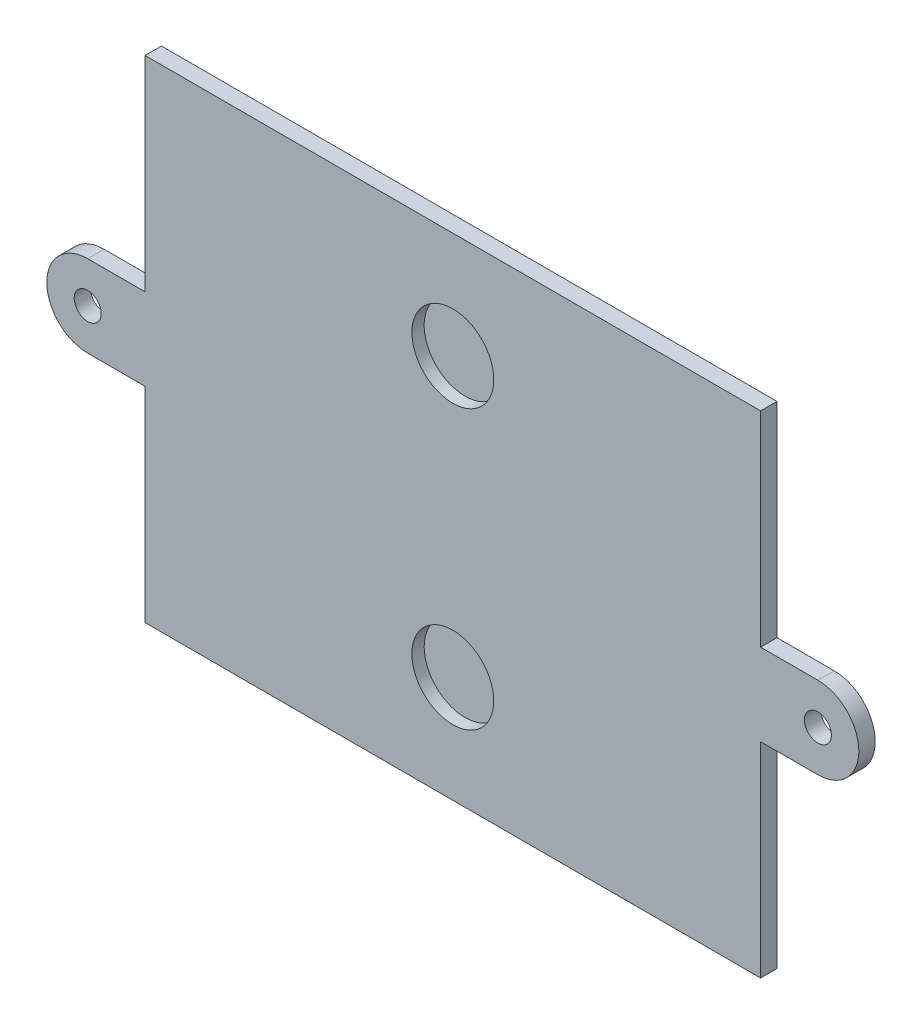
ISO-10303-21;
HEADER;
FILE_DESCRIPTION(('STEP AP214'),'2;1');
FILE_NAME('part.step','',(''),(''),'','','');
FILE_SCHEMA(('AUTOMOTIVE_DESIGN { 1 0 10303 214 1 1 1 1 }'));
ENDSEC;
DATA;
#1=APPLICATION_CONTEXT('core data for automotive mechanical design processes');
#2=APPLICATION_PROTOCOL_DEFINITION('international standard','automotive_design',2000,#1);
#3=PRODUCT_CONTEXT('',#1,'mechanical');
#4=PRODUCT('Part','Part','',(#3));
#5=PRODUCT_RELATED_PRODUCT_CATEGORY('part','',(#4));
#6=PRODUCT_DEFINITION_FORMATION('','',#4);
#7=PRODUCT_DEFINITION_CONTEXT('part definition',#1,'design');
#8=PRODUCT_DEFINITION('design','',#6,#7);
#9=PRODUCT_DEFINITION_SHAPE('','',#8);
#10=(LENGTH_UNIT() NAMED_UNIT(*) SI_UNIT(.MILLI.,.METRE.));
#11=(NAMED_UNIT(*) PLANE_ANGLE_UNIT() SI_UNIT($,.RADIAN.));
#12=(NAMED_UNIT(*) SI_UNIT($,.STERADIAN.) SOLID_ANGLE_UNIT());
#13=UNCERTAINTY_MEASURE_WITH_UNIT(LENGTH_MEASURE(1.E-05),#10,'distance_accuracy_value','');
#14=(GEOMETRIC_REPRESENTATION_CONTEXT(3) GLOBAL_UNCERTAINTY_ASSIGNED_CONTEXT((#13)) GLOBAL_UNIT_ASSIGNED_CONTEXT((#10,
#11,#12)) REPRESENTATION_CONTEXT('',''));
#15=CARTESIAN_POINT('',(0.,0.,0.));
#16=DIRECTION('',(0.,0.,1.));
#17=DIRECTION('',(1.,0.,0.));
#18=AXIS2_PLACEMENT_3D('',#15,#16,#17);
#19=CARTESIAN_POINT('',(0.,35.,2.));
#20=DIRECTION('',(0.,-1.,0.));
#21=DIRECTION('',(0.,0.,-1.));
#22=AXIS2_PLACEMENT_3D('',#19,#20,#21);
#23=PLANE('',#22);
#24=DIRECTION('',(-1.,0.,0.));
#25=VECTOR('',#24,1.);
#26=CARTESIAN_POINT('',(0.,35.,0.));
#27=LINE('',#26,#25);
#28=CARTESIAN_POINT('',(0.,35.,0.));
#29=VERTEX_POINT('',#28);
#30=CARTESIAN_POINT('',(-7.,35.,0.));
#31=VERTEX_POINT('',#30);
#32=EDGE_CURVE('E180',#29,#31,#27,.T.);
#33=ORIENTED_EDGE('',*,*,#32,.T.);
#34=DIRECTION('',(0.,0.,-1.));
#35=VECTOR('',#34,1.);
#36=CARTESIAN_POINT('',(-7.,35.,2.));
#37=LINE('',#36,#35);
#38=CARTESIAN_POINT('',(-7.,35.,2.));
#39=VERTEX_POINT('',#38);
#40=EDGE_CURVE('E11',#39,#31,#37,.T.);
#41=ORIENTED_EDGE('',*,*,#40,.F.);
#42=DIRECTION('',(-1.,0.,0.));
#43=VECTOR('',#42,1.);
#44=CARTESIAN_POINT('',(0.,35.,2.));
#45=LINE('',#44,#43);
#46=CARTESIAN_POINT('',(0.,35.,2.));
#47=VERTEX_POINT('',#46);
#48=EDGE_CURVE('E311',#47,#39,#45,.T.);
#49=ORIENTED_EDGE('',*,*,#48,.F.);
#50=DIRECTION('',(0.,0.,-1.));
#51=VECTOR('',#50,1.);
#52=CARTESIAN_POINT('',(0.,35.,2.));
#53=LINE('',#52,#51);
#54=EDGE_CURVE('E59',#47,#29,#53,.T.);
#55=ORIENTED_EDGE('',*,*,#54,.T.);
#56=EDGE_LOOP('',(#33,#41,#49,#55));
#57=FACE_BOUND('',#56,.T.);
#58=ADVANCED_FACE('F41',(#57),#23,.F.);
#59=CARTESIAN_POINT('',(-7.,30.,2.));
#60=DIRECTION('',(0.,0.,-1.));
#61=DIRECTION('',(-1.,0.,0.));
#62=AXIS2_PLACEMENT_3D('',#59,#60,#61);
#63=CYLINDRICAL_SURFACE('',#62,5.);
#64=CARTESIAN_POINT('',(-7.,30.,0.));
#65=DIRECTION('',(0.,0.,1.));
#66=DIRECTION('',(1.,0.,0.));
#67=AXIS2_PLACEMENT_3D('',#64,#65,#66);
#68=CIRCLE('',#67,5.);
#69=CARTESIAN_POINT('',(-7.,25.,0.));
#70=VERTEX_POINT('',#69);
#71=EDGE_CURVE('E184',#31,#70,#68,.T.);
#72=ORIENTED_EDGE('',*,*,#71,.T.);
#73=DIRECTION('',(0.,0.,-1.));
#74=VECTOR('',#73,1.);
#75=CARTESIAN_POINT('',(-7.,25.,2.));
#76=LINE('',#75,#74);
#77=CARTESIAN_POINT('',(-7.,25.,2.));
#78=VERTEX_POINT('',#77);
#79=EDGE_CURVE('E51',#78,#70,#76,.T.);
#80=ORIENTED_EDGE('',*,*,#79,.F.);
#81=CARTESIAN_POINT('',(-7.,30.,2.));
#82=DIRECTION('',(0.,0.,1.));
#83=DIRECTION('',(1.,0.,0.));
#84=AXIS2_PLACEMENT_3D('',#81,#82,#83);
#85=CIRCLE('',#84,5.);
#86=EDGE_CURVE('E109',#39,#78,#85,.T.);
#87=ORIENTED_EDGE('',*,*,#86,.F.);
#88=ORIENTED_EDGE('',*,*,#40,.T.);
#89=EDGE_LOOP('',(#72,#80,#87,#88));
#90=FACE_BOUND('',#89,.T.);
#91=ADVANCED_FACE('F315',(#90),#63,.T.);
#92=CARTESIAN_POINT('',(0.,25.,2.));
#93=DIRECTION('',(0.,1.,0.));
#94=DIRECTION('',(0.,0.,1.));
#95=AXIS2_PLACEMENT_3D('',#92,#93,#94);
#96=PLANE('',#95);
#97=DIRECTION('',(1.,0.,0.));
#98=VECTOR('',#97,1.);
#99=CARTESIAN_POINT('',(0.,25.,0.));
#100=LINE('',#99,#98);
#101=CARTESIAN_POINT('',(0.,25.,0.));
#102=VERTEX_POINT('',#101);
#103=EDGE_CURVE('E187',#70,#102,#100,.T.);
#104=ORIENTED_EDGE('',*,*,#103,.T.);
#105=DIRECTION('',(0.,0.,-1.));
#106=VECTOR('',#105,1.);
#107=CARTESIAN_POINT('',(0.,25.,2.));
#108=LINE('',#107,#106);
#109=CARTESIAN_POINT('',(0.,25.,2.));
#110=VERTEX_POINT('',#109);
#111=EDGE_CURVE('E245',#110,#102,#108,.T.);
#112=ORIENTED_EDGE('',*,*,#111,.F.);
#113=DIRECTION('',(1.,0.,0.));
#114=VECTOR('',#113,1.);
#115=CARTESIAN_POINT('',(0.,25.,2.));
#116=LINE('',#115,#114);
#117=EDGE_CURVE('E254',#78,#110,#116,.T.);
#118=ORIENTED_EDGE('',*,*,#117,.F.);
#119=ORIENTED_EDGE('',*,*,#79,.T.);
#120=EDGE_LOOP('',(#104,#112,#118,#119));
#121=FACE_BOUND('',#120,.T.);
#122=ADVANCED_FACE('F252',(#121),#96,.F.);
#123=CARTESIAN_POINT('',(0.,0.,2.));
#124=DIRECTION('',(-1.,0.,0.));
#125=DIRECTION('',(0.,0.,1.));
#126=AXIS2_PLACEMENT_3D('',#123,#124,#125);
#127=PLANE('',#126);
#128=DIRECTION('',(0.,1.,0.));
#129=VECTOR('',#128,1.);
#130=CARTESIAN_POINT('',(0.,0.,0.));
#131=LINE('',#130,#129);
#132=CARTESIAN_POINT('',(0.,0.,0.));
#133=VERTEX_POINT('',#132);
#134=EDGE_CURVE('E191',#133,#102,#131,.T.);
#135=ORIENTED_EDGE('',*,*,#134,.F.);
#136=DIRECTION('',(0.,0.,-1.));
#137=VECTOR('',#136,1.);
#138=CARTESIAN_POINT('',(0.,0.,2.));
#139=LINE('',#138,#137);
#140=CARTESIAN_POINT('',(0.,0.,2.));
#141=VERTEX_POINT('',#140);
#142=EDGE_CURVE('E242',#141,#133,#139,.T.);
#143=ORIENTED_EDGE('',*,*,#142,.F.);
#144=DIRECTION('',(0.,1.,0.));
#145=VECTOR('',#144,1.);
#146=CARTESIAN_POINT('',(0.,0.,2.));
#147=LINE('',#146,#145);
#148=EDGE_CURVE('E169',#141,#110,#147,.T.);
#149=ORIENTED_EDGE('',*,*,#148,.T.);
#150=ORIENTED_EDGE('',*,*,#111,.T.);
#151=EDGE_LOOP('',(#135,#143,#149,#150));
#152=FACE_BOUND('',#151,.T.);
#153=ADVANCED_FACE('F262',(#152),#127,.T.);
#154=CARTESIAN_POINT('',(0.,0.,2.));
#155=DIRECTION('',(0.,1.,0.));
#156=DIRECTION('',(0.,0.,1.));
#157=AXIS2_PLACEMENT_3D('',#154,#155,#156);
#158=PLANE('',#157);
#159=DIRECTION('',(1.,0.,0.));
#160=VECTOR('',#159,1.);
#161=CARTESIAN_POINT('',(0.,0.,0.));
#162=LINE('',#161,#160);
#163=CARTESIAN_POINT('',(75.2,0.,0.));
#164=VERTEX_POINT('',#163);
#165=EDGE_CURVE('E195',#133,#164,#162,.T.);
#166=ORIENTED_EDGE('',*,*,#165,.T.);
#167=DIRECTION('',(0.,0.,-1.));
#168=VECTOR('',#167,1.);
#169=CARTESIAN_POINT('',(75.2,0.,2.));
#170=LINE('',#169,#168);
#171=CARTESIAN_POINT('',(75.2,0.,2.));
#172=VERTEX_POINT('',#171);
#173=EDGE_CURVE('E238',#172,#164,#170,.T.);
#174=ORIENTED_EDGE('',*,*,#173,.F.);
#175=DIRECTION('',(1.,0.,0.));
#176=VECTOR('',#175,1.);
#177=CARTESIAN_POINT('',(0.,0.,2.));
#178=LINE('',#177,#176);
#179=EDGE_CURVE('E267',#141,#172,#178,.T.);
#180=ORIENTED_EDGE('',*,*,#179,.F.);
#181=ORIENTED_EDGE('',*,*,#142,.T.);
#182=EDGE_LOOP('',(#166,#174,#180,#181));
#183=FACE_BOUND('',#182,.T.);
#184=ADVANCED_FACE('F324',(#183),#158,.F.);
#185=CARTESIAN_POINT('',(75.2,0.,2.));
#186=DIRECTION('',(-1.,0.,0.));
#187=DIRECTION('',(0.,0.,1.));
#188=AXIS2_PLACEMENT_3D('',#185,#186,#187);
#189=PLANE('',#188);
#190=DIRECTION('',(0.,1.,0.));
#191=VECTOR('',#190,1.);
#192=CARTESIAN_POINT('',(75.2,0.,0.));
#193=LINE('',#192,#191);
#194=CARTESIAN_POINT('',(75.2,25.,0.));
#195=VERTEX_POINT('',#194);
#196=EDGE_CURVE('E199',#164,#195,#193,.T.);
#197=ORIENTED_EDGE('',*,*,#196,.T.);
#198=DIRECTION('',(0.,0.,-1.));
#199=VECTOR('',#198,1.);
#200=CARTESIAN_POINT('',(75.2,25.,2.));
#201=LINE('',#200,#199);
#202=CARTESIAN_POINT('',(75.2,25.,2.));
#203=VERTEX_POINT('',#202);
#204=EDGE_CURVE('E235',#203,#195,#201,.T.);
#205=ORIENTED_EDGE('',*,*,#204,.F.);
#206=DIRECTION('',(0.,1.,0.));
#207=VECTOR('',#206,1.);
#208=CARTESIAN_POINT('',(75.2,0.,2.));
#209=LINE('',#208,#207);
#210=EDGE_CURVE('E151',#172,#203,#209,.T.);
#211=ORIENTED_EDGE('',*,*,#210,.F.);
#212=ORIENTED_EDGE('',*,*,#173,.T.);
#213=EDGE_LOOP('',(#197,#205,#211,#212));
#214=FACE_BOUND('',#213,.T.);
#215=ADVANCED_FACE('F327',(#214),#189,.F.);
#216=CARTESIAN_POINT('',(0.,25.,2.));
#217=DIRECTION('',(0.,-1.,0.));
#218=DIRECTION('',(0.,0.,-1.));
#219=AXIS2_PLACEMENT_3D('',#216,#217,#218);
#220=PLANE('',#219);
#221=DIRECTION('',(-1.,0.,0.));
#222=VECTOR('',#221,1.);
#223=CARTESIAN_POINT('',(0.,25.,0.));
#224=LINE('',#223,#222);
#225=CARTESIAN_POINT('',(82.2,25.,0.));
#226=VERTEX_POINT('',#225);
#227=EDGE_CURVE('E203',#226,#195,#224,.T.);
#228=ORIENTED_EDGE('',*,*,#227,.F.);
#229=DIRECTION('',(0.,0.,-1.));
#230=VECTOR('',#229,1.);
#231=CARTESIAN_POINT('',(82.2,25.,2.));
#232=LINE('',#231,#230);
#233=CARTESIAN_POINT('',(82.2,25.,2.));
#234=VERTEX_POINT('',#233);
#235=EDGE_CURVE('E232',#234,#226,#232,.T.);
#236=ORIENTED_EDGE('',*,*,#235,.F.);
#237=DIRECTION('',(-1.,0.,0.));
#238=VECTOR('',#237,1.);
#239=CARTESIAN_POINT('',(0.,25.,2.));
#240=LINE('',#239,#238);
#241=EDGE_CURVE('E275',#234,#203,#240,.T.);
#242=ORIENTED_EDGE('',*,*,#241,.T.);
#243=ORIENTED_EDGE('',*,*,#204,.T.);
#244=EDGE_LOOP('',(#228,#236,#242,#243));
#245=FACE_BOUND('',#244,.T.);
#246=ADVANCED_FACE('F329',(#245),#220,.T.);
#247=CARTESIAN_POINT('',(82.2,30.,2.));
#248=DIRECTION('',(0.,0.,-1.));
#249=DIRECTION('',(-1.,0.,0.));
#250=AXIS2_PLACEMENT_3D('',#247,#248,#249);
#251=CYLINDRICAL_SURFACE('',#250,5.);
#252=CARTESIAN_POINT('',(82.2,30.,0.));
#253=DIRECTION('',(0.,0.,1.));
#254=DIRECTION('',(1.,0.,0.));
#255=AXIS2_PLACEMENT_3D('',#252,#253,#254);
#256=CIRCLE('',#255,5.);
#257=CARTESIAN_POINT('',(82.2,35.,0.));
#258=VERTEX_POINT('',#257);
#259=EDGE_CURVE('E207',#258,#226,#256,.F.);
#260=ORIENTED_EDGE('',*,*,#259,.F.);
#261=DIRECTION('',(0.,0.,-1.));
#262=VECTOR('',#261,1.);
#263=CARTESIAN_POINT('',(82.2,35.,2.));
#264=LINE('',#263,#262);
#265=CARTESIAN_POINT('',(82.2,35.,2.));
#266=VERTEX_POINT('',#265);
#267=EDGE_CURVE('E229',#266,#258,#264,.T.);
#268=ORIENTED_EDGE('',*,*,#267,.F.);
#269=CARTESIAN_POINT('',(82.2,30.,2.));
#270=DIRECTION('',(0.,0.,1.));
#271=DIRECTION('',(1.,0.,0.));
#272=AXIS2_PLACEMENT_3D('',#269,#270,#271);
#273=CIRCLE('',#272,5.);
#274=EDGE_CURVE('E278',#266,#234,#273,.F.);
#275=ORIENTED_EDGE('',*,*,#274,.T.);
#276=ORIENTED_EDGE('',*,*,#235,.T.);
#277=EDGE_LOOP('',(#260,#268,#275,#276));
#278=FACE_BOUND('',#277,.T.);
#279=ADVANCED_FACE('F332',(#278),#251,.T.);
#280=CARTESIAN_POINT('',(0.,35.,2.));
#281=DIRECTION('',(0.,1.,0.));
#282=DIRECTION('',(0.,0.,1.));
#283=AXIS2_PLACEMENT_3D('',#280,#281,#282);
#284=PLANE('',#283);
#285=DIRECTION('',(1.,0.,0.));
#286=VECTOR('',#285,1.);
#287=CARTESIAN_POINT('',(0.,35.,0.));
#288=LINE('',#287,#286);
#289=CARTESIAN_POINT('',(75.2,35.,0.));
#290=VERTEX_POINT('',#289);
#291=EDGE_CURVE('E211',#290,#258,#288,.T.);
#292=ORIENTED_EDGE('',*,*,#291,.F.);
#293=DIRECTION('',(0.,0.,-1.));
#294=VECTOR('',#293,1.);
#295=CARTESIAN_POINT('',(75.2,35.,2.));
#296=LINE('',#295,#294);
#297=CARTESIAN_POINT('',(75.2,35.,2.));
#298=VERTEX_POINT('',#297);
#299=EDGE_CURVE('E160',#298,#290,#296,.T.);
#300=ORIENTED_EDGE('',*,*,#299,.F.);
#301=DIRECTION('',(1.,0.,0.));
#302=VECTOR('',#301,1.);
#303=CARTESIAN_POINT('',(0.,35.,2.));
#304=LINE('',#303,#302);
#305=EDGE_CURVE('E147',#298,#266,#304,.T.);
#306=ORIENTED_EDGE('',*,*,#305,.T.);
#307=ORIENTED_EDGE('',*,*,#267,.T.);
#308=EDGE_LOOP('',(#292,#300,#306,#307));
#309=FACE_BOUND('',#308,.T.);
#310=ADVANCED_FACE('F285',(#309),#284,.T.);
#311=CARTESIAN_POINT('',(75.2,60.,0.));
#312=VERTEX_POINT('',#311);
#313=EDGE_CURVE('E156',#290,#312,#193,.T.);
#314=ORIENTED_EDGE('',*,*,#313,.T.);
#315=DIRECTION('',(0.,0.,-1.));
#316=VECTOR('',#315,1.);
#317=CARTESIAN_POINT('',(75.2,60.,2.));
#318=LINE('',#317,#316);
#319=CARTESIAN_POINT('',(75.2,60.,2.));
#320=VERTEX_POINT('',#319);
#321=EDGE_CURVE('E153',#320,#312,#318,.T.);
#322=ORIENTED_EDGE('',*,*,#321,.F.);
#323=EDGE_CURVE('E138',#298,#320,#209,.T.);
#324=ORIENTED_EDGE('',*,*,#323,.F.);
#325=ORIENTED_EDGE('',*,*,#299,.T.);
#326=EDGE_LOOP('',(#314,#322,#324,#325));
#327=FACE_BOUND('',#326,.T.);
#328=ADVANCED_FACE('F154',(#327),#189,.F.);
#329=CARTESIAN_POINT('',(0.,60.,2.));
#330=DIRECTION('',(0.,1.,0.));
#331=DIRECTION('',(0.,0.,1.));
#332=AXIS2_PLACEMENT_3D('',#329,#330,#331);
#333=PLANE('',#332);
#334=DIRECTION('',(1.,0.,0.));
#335=VECTOR('',#334,1.);
#336=CARTESIAN_POINT('',(0.,60.,0.));
#337=LINE('',#336,#335);
#338=CARTESIAN_POINT('',(0.,60.,0.));
#339=VERTEX_POINT('',#338);
#340=EDGE_CURVE('E215',#339,#312,#337,.T.);
#341=ORIENTED_EDGE('',*,*,#340,.F.);
#342=DIRECTION('',(0.,0.,-1.));
#343=VECTOR('',#342,1.);
#344=CARTESIAN_POINT('',(0.,60.,2.));
#345=LINE('',#344,#343);
#346=CARTESIAN_POINT('',(0.,60.,2.));
#347=VERTEX_POINT('',#346);
#348=EDGE_CURVE('E97',#347,#339,#345,.T.);
#349=ORIENTED_EDGE('',*,*,#348,.F.);
#350=DIRECTION('',(1.,0.,0.));
#351=VECTOR('',#350,1.);
#352=CARTESIAN_POINT('',(0.,60.,2.));
#353=LINE('',#352,#351);
#354=EDGE_CURVE('E144',#347,#320,#353,.T.);
#355=ORIENTED_EDGE('',*,*,#354,.T.);
#356=ORIENTED_EDGE('',*,*,#321,.T.);
#357=EDGE_LOOP('',(#341,#349,#355,#356));
#358=FACE_BOUND('',#357,.T.);
#359=ADVANCED_FACE('F162',(#358),#333,.T.);
#360=EDGE_CURVE('E196',#29,#339,#131,.T.);
#361=ORIENTED_EDGE('',*,*,#360,.F.);
#362=ORIENTED_EDGE('',*,*,#54,.F.);
#363=EDGE_CURVE('E164',#47,#347,#147,.T.);
#364=ORIENTED_EDGE('',*,*,#363,.T.);
#365=ORIENTED_EDGE('',*,*,#348,.T.);
#366=EDGE_LOOP('',(#361,#362,#364,#365));
#367=FACE_BOUND('',#366,.T.);
#368=ADVANCED_FACE('F342',(#367),#127,.T.);
#369=CARTESIAN_POINT('',(-7.,30.,2.));
#370=DIRECTION('',(0.,0.,-1.));
#371=DIRECTION('',(-1.,0.,0.));
#372=AXIS2_PLACEMENT_3D('',#369,#370,#371);
#373=CYLINDRICAL_SURFACE('',#372,1.65);
#374=CARTESIAN_POINT('',(-7.,30.,2.));
#375=DIRECTION('',(0.,0.,1.));
#376=DIRECTION('',(1.,0.,0.));
#377=AXIS2_PLACEMENT_3D('',#374,#375,#376);
#378=CIRCLE('',#377,1.65);
#379=CARTESIAN_POINT('',(-5.35,30.,2.));
#380=VERTEX_POINT('',#379);
#381=EDGE_CURVE('E222',#380,#380,#378,.T.);
#382=ORIENTED_EDGE('',*,*,#381,.T.);
#383=EDGE_LOOP('',(#382));
#384=FACE_BOUND('',#383,.T.);
#385=CARTESIAN_POINT('',(-7.,30.,0.));
#386=DIRECTION('',(0.,0.,1.));
#387=DIRECTION('',(1.,0.,0.));
#388=AXIS2_PLACEMENT_3D('',#385,#386,#387);
#389=CIRCLE('',#388,1.65);
#390=CARTESIAN_POINT('',(-5.35,30.,0.));
#391=VERTEX_POINT('',#390);
#392=EDGE_CURVE('E176',#391,#391,#389,.T.);
#393=ORIENTED_EDGE('',*,*,#392,.F.);
#394=EDGE_LOOP('',(#393));
#395=FACE_BOUND('',#394,.T.);
#396=ADVANCED_FACE('F43',(#384,#395),#373,.F.);
#397=CARTESIAN_POINT('',(82.2,30.,2.));
#398=DIRECTION('',(0.,0.,-1.));
#399=DIRECTION('',(-1.,0.,0.));
#400=AXIS2_PLACEMENT_3D('',#397,#398,#399);
#401=CYLINDRICAL_SURFACE('',#400,1.65);
#402=CARTESIAN_POINT('',(82.2,30.,2.));
#403=DIRECTION('',(0.,0.,1.));
#404=DIRECTION('',(1.,0.,0.));
#405=AXIS2_PLACEMENT_3D('',#402,#403,#404);
#406=CIRCLE('',#405,1.65);
#407=CARTESIAN_POINT('',(83.85,30.,2.));
#408=VERTEX_POINT('',#407);
#409=EDGE_CURVE('E167',#408,#408,#406,.T.);
#410=ORIENTED_EDGE('',*,*,#409,.T.);
#411=EDGE_LOOP('',(#410));
#412=FACE_BOUND('',#411,.T.);
#413=CARTESIAN_POINT('',(82.2,30.,0.));
#414=DIRECTION('',(0.,0.,1.));
#415=DIRECTION('',(1.,0.,0.));
#416=AXIS2_PLACEMENT_3D('',#413,#414,#415);
#417=CIRCLE('',#416,1.65);
#418=CARTESIAN_POINT('',(83.85,30.,0.));
#419=VERTEX_POINT('',#418);
#420=EDGE_CURVE('E218',#419,#419,#417,.T.);
#421=ORIENTED_EDGE('',*,*,#420,.F.);
#422=EDGE_LOOP('',(#421));
#423=FACE_BOUND('',#422,.T.);
#424=ADVANCED_FACE('F345',(#412,#423),#401,.F.);
#425=CARTESIAN_POINT('',(0.,0.,2.));
#426=DIRECTION('',(0.,0.,1.));
#427=DIRECTION('',(1.,0.,0.));
#428=AXIS2_PLACEMENT_3D('',#425,#426,#427);
#429=PLANE('',#428);
#430=CARTESIAN_POINT('',(37.6,47.,2.));
#431=DIRECTION('',(0.,0.,1.));
#432=DIRECTION('',(1.,0.,0.));
#433=AXIS2_PLACEMENT_3D('',#430,#431,#432);
#434=CIRCLE('',#433,5.);
#435=CARTESIAN_POINT('',(42.6,47.,2.));
#436=VERTEX_POINT('',#435);
#437=EDGE_CURVE('E293',#436,#436,#434,.T.);
#438=ORIENTED_EDGE('',*,*,#437,.F.);
#439=EDGE_LOOP('',(#438));
#440=FACE_BOUND('',#439,.T.);
#441=CARTESIAN_POINT('',(37.6,13.,2.));
#442=DIRECTION('',(0.,0.,1.));
#443=DIRECTION('',(-1.,0.,0.));
#444=AXIS2_PLACEMENT_3D('',#441,#442,#443);
#445=CIRCLE('',#444,5.);
#446=CARTESIAN_POINT('',(32.6,13.,2.));
#447=VERTEX_POINT('',#446);
#448=EDGE_CURVE('E301',#447,#447,#445,.T.);
#449=ORIENTED_EDGE('',*,*,#448,.F.);
#450=EDGE_LOOP('',(#449));
#451=FACE_BOUND('',#450,.T.);
#452=ORIENTED_EDGE('',*,*,#381,.F.);
#453=EDGE_LOOP('',(#452));
#454=FACE_BOUND('',#453,.T.);
#455=ORIENTED_EDGE('',*,*,#48,.T.);
#456=ORIENTED_EDGE('',*,*,#86,.T.);
#457=ORIENTED_EDGE('',*,*,#117,.T.);
#458=ORIENTED_EDGE('',*,*,#148,.F.);
#459=ORIENTED_EDGE('',*,*,#179,.T.);
#460=ORIENTED_EDGE('',*,*,#210,.T.);
#461=ORIENTED_EDGE('',*,*,#241,.F.);
#462=ORIENTED_EDGE('',*,*,#274,.F.);
#463=ORIENTED_EDGE('',*,*,#305,.F.);
#464=ORIENTED_EDGE('',*,*,#323,.T.);
#465=ORIENTED_EDGE('',*,*,#354,.F.);
#466=ORIENTED_EDGE('',*,*,#363,.F.);
#467=EDGE_LOOP('',(#455,#456,#457,#458,#459,#460,#461,#462,#463,#464,#465,#466));
#468=FACE_BOUND('',#467,.T.);
#469=ORIENTED_EDGE('',*,*,#409,.F.);
#470=EDGE_LOOP('',(#469));
#471=FACE_BOUND('',#470,.T.);
#472=ADVANCED_FACE('F140',(#440,#451,#454,#468,#471),#429,.T.);
#473=CARTESIAN_POINT('',(0.,0.,0.));
#474=DIRECTION('',(0.,0.,1.));
#475=DIRECTION('',(1.,0.,0.));
#476=AXIS2_PLACEMENT_3D('',#473,#474,#475);
#477=PLANE('',#476);
#478=ORIENTED_EDGE('',*,*,#392,.T.);
#479=EDGE_LOOP('',(#478));
#480=FACE_BOUND('',#479,.T.);
#481=ORIENTED_EDGE('',*,*,#32,.F.);
#482=ORIENTED_EDGE('',*,*,#360,.T.);
#483=ORIENTED_EDGE('',*,*,#340,.T.);
#484=ORIENTED_EDGE('',*,*,#313,.F.);
#485=ORIENTED_EDGE('',*,*,#291,.T.);
#486=ORIENTED_EDGE('',*,*,#259,.T.);
#487=ORIENTED_EDGE('',*,*,#227,.T.);
#488=ORIENTED_EDGE('',*,*,#196,.F.);
#489=ORIENTED_EDGE('',*,*,#165,.F.);
#490=ORIENTED_EDGE('',*,*,#134,.T.);
#491=ORIENTED_EDGE('',*,*,#103,.F.);
#492=ORIENTED_EDGE('',*,*,#71,.F.);
#493=EDGE_LOOP('',(#481,#482,#483,#484,#485,#486,#487,#488,#489,#490,#491,#492));
#494=FACE_BOUND('',#493,.T.);
#495=ORIENTED_EDGE('',*,*,#420,.T.);
#496=EDGE_LOOP('',(#495));
#497=FACE_BOUND('',#496,.T.);
#498=ADVANCED_FACE('F256',(#480,#494,#497),#477,.F.);
#499=CARTESIAN_POINT('',(37.6,13.,0.5));
#500=DIRECTION('',(0.,0.,1.));
#501=DIRECTION('',(1.,0.,0.));
#502=AXIS2_PLACEMENT_3D('',#499,#500,#501);
#503=CYLINDRICAL_SURFACE('',#502,5.);
#504=CARTESIAN_POINT('',(37.6,13.,0.5));
#505=DIRECTION('',(0.,0.,1.));
#506=DIRECTION('',(-1.,0.,0.));
#507=AXIS2_PLACEMENT_3D('',#504,#505,#506);
#508=CIRCLE('',#507,5.);
#509=CARTESIAN_POINT('',(32.6,13.,0.5));
#510=VERTEX_POINT('',#509);
#511=EDGE_CURVE('E297',#510,#510,#508,.T.);
#512=ORIENTED_EDGE('',*,*,#511,.F.);
#513=EDGE_LOOP('',(#512));
#514=FACE_BOUND('',#513,.T.);
#515=ORIENTED_EDGE('',*,*,#448,.T.);
#516=EDGE_LOOP('',(#515));
#517=FACE_BOUND('',#516,.T.);
#518=ADVANCED_FACE('F351',(#514,#517),#503,.F.);
#519=CARTESIAN_POINT('',(37.6,13.,0.5));
#520=DIRECTION('',(0.,0.,-1.));
#521=DIRECTION('',(-1.,0.,0.));
#522=AXIS2_PLACEMENT_3D('',#519,#520,#521);
#523=PLANE('',#522);
#524=ORIENTED_EDGE('',*,*,#511,.T.);
#525=EDGE_LOOP('',(#524));
#526=FACE_BOUND('',#525,.T.);
#527=ADVANCED_FACE('F358',(#526),#523,.F.);
#528=CARTESIAN_POINT('',(37.6,47.,0.5));
#529=DIRECTION('',(0.,0.,1.));
#530=DIRECTION('',(1.,0.,0.));
#531=AXIS2_PLACEMENT_3D('',#528,#529,#530);
#532=CYLINDRICAL_SURFACE('',#531,5.);
#533=CARTESIAN_POINT('',(37.6,47.,0.5));
#534=DIRECTION('',(0.,0.,1.));
#535=DIRECTION('',(1.,0.,0.));
#536=AXIS2_PLACEMENT_3D('',#533,#534,#535);
#537=CIRCLE('',#536,5.);
#538=CARTESIAN_POINT('',(42.6,47.,0.5));
#539=VERTEX_POINT('',#538);
#540=EDGE_CURVE('E181',#539,#539,#537,.T.);
#541=ORIENTED_EDGE('',*,*,#540,.F.);
#542=EDGE_LOOP('',(#541));
#543=FACE_BOUND('',#542,.T.);
#544=ORIENTED_EDGE('',*,*,#437,.T.);
#545=EDGE_LOOP('',(#544));
#546=FACE_BOUND('',#545,.T.);
#547=ADVANCED_FACE('F362',(#543,#546),#532,.F.);
#548=CARTESIAN_POINT('',(37.6,47.,0.5));
#549=DIRECTION('',(0.,0.,1.));
#550=DIRECTION('',(1.,0.,0.));
#551=AXIS2_PLACEMENT_3D('',#548,#549,#550);
#552=PLANE('',#551);
#553=ORIENTED_EDGE('',*,*,#540,.T.);
#554=EDGE_LOOP('',(#553));
#555=FACE_BOUND('',#554,.T.);
#556=ADVANCED_FACE('F366',(#555),#552,.T.);
#557=CLOSED_SHELL('',(#58,#91,#122,#153,#184,#215,#246,#279,#310,#328,#359,#368,#396,#424,#472,
#498,#518,#527,#547,#556));
#558=MANIFOLD_SOLID_BREP('B2',#557);
#559=ADVANCED_BREP_SHAPE_REPRESENTATION('',(#18,#558),#14);
#560=SHAPE_DEFINITION_REPRESENTATION(#9,#559);
ENDSEC;
END-ISO-10303-21;
